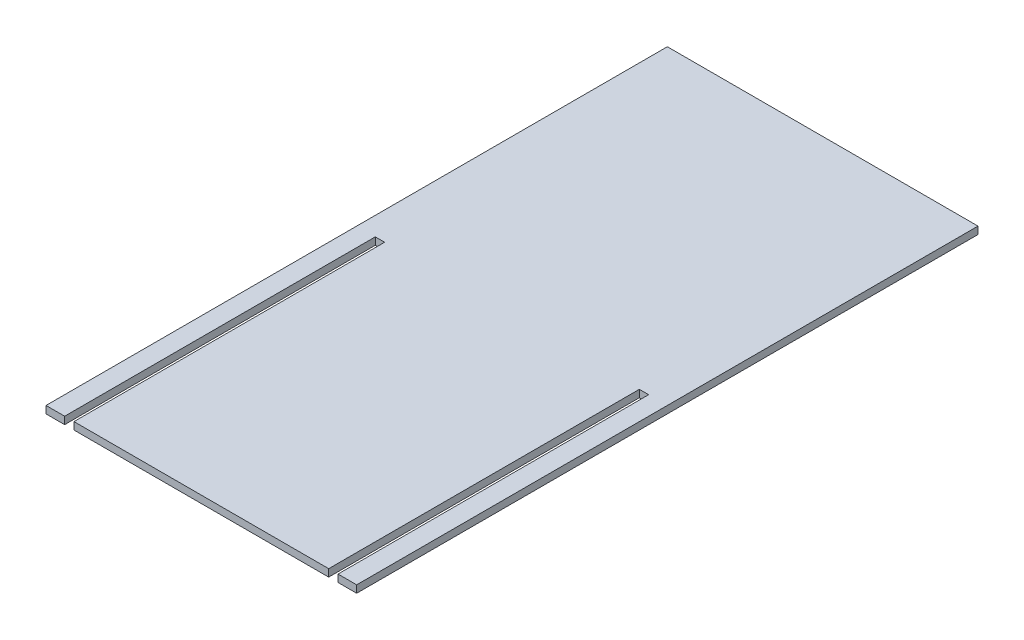
ISO-10303-21;
HEADER;
FILE_DESCRIPTION(('STEP AP214'),'2;1');
FILE_NAME('part.step','',(''),(''),'','','');
FILE_SCHEMA(('AUTOMOTIVE_DESIGN { 1 0 10303 214 1 1 1 1 }'));
ENDSEC;
DATA;
#1=APPLICATION_CONTEXT('core data for automotive mechanical design processes');
#2=APPLICATION_PROTOCOL_DEFINITION('international standard','automotive_design',2000,#1);
#3=PRODUCT_CONTEXT('',#1,'mechanical');
#4=PRODUCT('Part','Part','',(#3));
#5=PRODUCT_RELATED_PRODUCT_CATEGORY('part','',(#4));
#6=PRODUCT_DEFINITION_FORMATION('','',#4);
#7=PRODUCT_DEFINITION_CONTEXT('part definition',#1,'design');
#8=PRODUCT_DEFINITION('design','',#6,#7);
#9=PRODUCT_DEFINITION_SHAPE('','',#8);
#10=(LENGTH_UNIT() NAMED_UNIT(*) SI_UNIT(.MILLI.,.METRE.));
#11=(NAMED_UNIT(*) PLANE_ANGLE_UNIT() SI_UNIT($,.RADIAN.));
#12=(NAMED_UNIT(*) SI_UNIT($,.STERADIAN.) SOLID_ANGLE_UNIT());
#13=UNCERTAINTY_MEASURE_WITH_UNIT(LENGTH_MEASURE(1.E-05),#10,'distance_accuracy_value','');
#14=(GEOMETRIC_REPRESENTATION_CONTEXT(3) GLOBAL_UNCERTAINTY_ASSIGNED_CONTEXT((#13)) GLOBAL_UNIT_ASSIGNED_CONTEXT((#10,
#11,#12)) REPRESENTATION_CONTEXT('',''));
#15=CARTESIAN_POINT('',(0.,0.,0.));
#16=DIRECTION('',(0.,0.,1.));
#17=DIRECTION('',(1.,0.,0.));
#18=AXIS2_PLACEMENT_3D('',#15,#16,#17);
#19=CARTESIAN_POINT('',(0.,3.,0.));
#20=DIRECTION('',(0.,0.,-1.));
#21=DIRECTION('',(-1.,0.,0.));
#22=AXIS2_PLACEMENT_3D('',#19,#20,#21);
#23=PLANE('',#22);
#24=DIRECTION('',(1.,0.,0.));
#25=VECTOR('',#24,1.);
#26=CARTESIAN_POINT('',(0.,3.,0.));
#27=LINE('',#26,#25);
#28=CARTESIAN_POINT('',(119.38,3.,0.));
#29=VERTEX_POINT('',#28);
#30=CARTESIAN_POINT('',(127.,3.,0.));
#31=VERTEX_POINT('',#30);
#32=EDGE_CURVE('E185',#29,#31,#27,.T.);
#33=ORIENTED_EDGE('',*,*,#32,.F.);
#34=DIRECTION('',(0.,1.,0.));
#35=VECTOR('',#34,1.);
#36=CARTESIAN_POINT('',(119.38,0.,0.));
#37=LINE('',#36,#35);
#38=CARTESIAN_POINT('',(119.38,0.,0.));
#39=VERTEX_POINT('',#38);
#40=EDGE_CURVE('E151',#39,#29,#37,.T.);
#41=ORIENTED_EDGE('',*,*,#40,.F.);
#42=DIRECTION('',(1.,0.,0.));
#43=VECTOR('',#42,1.);
#44=CARTESIAN_POINT('',(0.,0.,0.));
#45=LINE('',#44,#43);
#46=CARTESIAN_POINT('',(127.,0.,0.));
#47=VERTEX_POINT('',#46);
#48=EDGE_CURVE('E142',#39,#47,#45,.T.);
#49=ORIENTED_EDGE('',*,*,#48,.T.);
#50=DIRECTION('',(0.,-1.,0.));
#51=VECTOR('',#50,1.);
#52=CARTESIAN_POINT('',(127.,3.,0.));
#53=LINE('',#52,#51);
#54=EDGE_CURVE('E41',#31,#47,#53,.T.);
#55=ORIENTED_EDGE('',*,*,#54,.F.);
#56=EDGE_LOOP('',(#33,#41,#49,#55));
#57=FACE_BOUND('',#56,.T.);
#58=ADVANCED_FACE('F33',(#57),#23,.F.);
#59=CARTESIAN_POINT('',(0.,0.,0.));
#60=VERTEX_POINT('',#59);
#61=CARTESIAN_POINT('',(7.62,0.,0.));
#62=VERTEX_POINT('',#61);
#63=EDGE_CURVE('E198',#60,#62,#45,.T.);
#64=ORIENTED_EDGE('',*,*,#63,.T.);
#65=DIRECTION('',(0.,1.,0.));
#66=VECTOR('',#65,1.);
#67=CARTESIAN_POINT('',(7.62,0.,0.));
#68=LINE('',#67,#66);
#69=CARTESIAN_POINT('',(7.62,3.,0.));
#70=VERTEX_POINT('',#69);
#71=EDGE_CURVE('E166',#62,#70,#68,.T.);
#72=ORIENTED_EDGE('',*,*,#71,.T.);
#73=CARTESIAN_POINT('',(0.,3.,0.));
#74=VERTEX_POINT('',#73);
#75=EDGE_CURVE('E187',#74,#70,#27,.T.);
#76=ORIENTED_EDGE('',*,*,#75,.F.);
#77=DIRECTION('',(0.,-1.,0.));
#78=VECTOR('',#77,1.);
#79=CARTESIAN_POINT('',(0.,3.,0.));
#80=LINE('',#79,#78);
#81=EDGE_CURVE('E11',#74,#60,#80,.T.);
#82=ORIENTED_EDGE('',*,*,#81,.T.);
#83=EDGE_LOOP('',(#64,#72,#76,#82));
#84=FACE_BOUND('',#83,.T.);
#85=ADVANCED_FACE('F241',(#84),#23,.F.);
#86=CARTESIAN_POINT('',(0.,3.,-254.));
#87=DIRECTION('',(1.,0.,0.));
#88=DIRECTION('',(0.,0.,-1.));
#89=AXIS2_PLACEMENT_3D('',#86,#87,#88);
#90=PLANE('',#89);
#91=DIRECTION('',(0.,0.,1.));
#92=VECTOR('',#91,1.);
#93=CARTESIAN_POINT('',(0.,0.,-254.));
#94=LINE('',#93,#92);
#95=CARTESIAN_POINT('',(0.,0.,-254.));
#96=VERTEX_POINT('',#95);
#97=EDGE_CURVE('E175',#96,#60,#94,.T.);
#98=ORIENTED_EDGE('',*,*,#97,.T.);
#99=ORIENTED_EDGE('',*,*,#81,.F.);
#100=DIRECTION('',(0.,0.,1.));
#101=VECTOR('',#100,1.);
#102=CARTESIAN_POINT('',(0.,3.,-254.));
#103=LINE('',#102,#101);
#104=CARTESIAN_POINT('',(0.,3.,-254.));
#105=VERTEX_POINT('',#104);
#106=EDGE_CURVE('E182',#105,#74,#103,.T.);
#107=ORIENTED_EDGE('',*,*,#106,.F.);
#108=DIRECTION('',(0.,-1.,0.));
#109=VECTOR('',#108,1.);
#110=CARTESIAN_POINT('',(0.,3.,-254.));
#111=LINE('',#110,#109);
#112=EDGE_CURVE('E195',#105,#96,#111,.T.);
#113=ORIENTED_EDGE('',*,*,#112,.T.);
#114=EDGE_LOOP('',(#98,#99,#107,#113));
#115=FACE_BOUND('',#114,.T.);
#116=ADVANCED_FACE('F35',(#115),#90,.F.);
#117=CARTESIAN_POINT('',(11.43,0.,0.));
#118=VERTEX_POINT('',#117);
#119=CARTESIAN_POINT('',(115.57,0.,0.));
#120=VERTEX_POINT('',#119);
#121=EDGE_CURVE('E202',#118,#120,#45,.T.);
#122=ORIENTED_EDGE('',*,*,#121,.T.);
#123=DIRECTION('',(0.,1.,0.));
#124=VECTOR('',#123,1.);
#125=CARTESIAN_POINT('',(115.57,0.,0.));
#126=LINE('',#125,#124);
#127=CARTESIAN_POINT('',(115.57,3.,0.));
#128=VERTEX_POINT('',#127);
#129=EDGE_CURVE('E154',#120,#128,#126,.T.);
#130=ORIENTED_EDGE('',*,*,#129,.T.);
#131=CARTESIAN_POINT('',(11.43,3.,0.));
#132=VERTEX_POINT('',#131);
#133=EDGE_CURVE('E191',#132,#128,#27,.T.);
#134=ORIENTED_EDGE('',*,*,#133,.F.);
#135=DIRECTION('',(0.,1.,0.));
#136=VECTOR('',#135,1.);
#137=CARTESIAN_POINT('',(11.43,0.,0.));
#138=LINE('',#137,#136);
#139=EDGE_CURVE('E178',#118,#132,#138,.T.);
#140=ORIENTED_EDGE('',*,*,#139,.F.);
#141=EDGE_LOOP('',(#122,#130,#134,#140));
#142=FACE_BOUND('',#141,.T.);
#143=ADVANCED_FACE('F237',(#142),#23,.F.);
#144=CARTESIAN_POINT('',(127.,3.,-254.));
#145=DIRECTION('',(-1.,0.,0.));
#146=DIRECTION('',(0.,0.,1.));
#147=AXIS2_PLACEMENT_3D('',#144,#145,#146);
#148=PLANE('',#147);
#149=DIRECTION('',(0.,0.,-1.));
#150=VECTOR('',#149,1.);
#151=CARTESIAN_POINT('',(127.,0.,-254.));
#152=LINE('',#151,#150);
#153=CARTESIAN_POINT('',(127.,0.,-254.));
#154=VERTEX_POINT('',#153);
#155=EDGE_CURVE('E201',#47,#154,#152,.T.);
#156=ORIENTED_EDGE('',*,*,#155,.T.);
#157=DIRECTION('',(0.,-1.,0.));
#158=VECTOR('',#157,1.);
#159=CARTESIAN_POINT('',(127.,3.,-254.));
#160=LINE('',#159,#158);
#161=CARTESIAN_POINT('',(127.,3.,-254.));
#162=VERTEX_POINT('',#161);
#163=EDGE_CURVE('E207',#162,#154,#160,.T.);
#164=ORIENTED_EDGE('',*,*,#163,.F.);
#165=DIRECTION('',(0.,0.,-1.));
#166=VECTOR('',#165,1.);
#167=CARTESIAN_POINT('',(127.,3.,-254.));
#168=LINE('',#167,#166);
#169=EDGE_CURVE('E190',#31,#162,#168,.T.);
#170=ORIENTED_EDGE('',*,*,#169,.F.);
#171=ORIENTED_EDGE('',*,*,#54,.T.);
#172=EDGE_LOOP('',(#156,#164,#170,#171));
#173=FACE_BOUND('',#172,.T.);
#174=ADVANCED_FACE('F213',(#173),#148,.F.);
#175=CARTESIAN_POINT('',(0.,3.,-254.));
#176=DIRECTION('',(0.,0.,1.));
#177=DIRECTION('',(1.,0.,0.));
#178=AXIS2_PLACEMENT_3D('',#175,#176,#177);
#179=PLANE('',#178);
#180=DIRECTION('',(-1.,0.,0.));
#181=VECTOR('',#180,1.);
#182=CARTESIAN_POINT('',(0.,0.,-254.));
#183=LINE('',#182,#181);
#184=EDGE_CURVE('E186',#154,#96,#183,.T.);
#185=ORIENTED_EDGE('',*,*,#184,.T.);
#186=ORIENTED_EDGE('',*,*,#112,.F.);
#187=DIRECTION('',(-1.,0.,0.));
#188=VECTOR('',#187,1.);
#189=CARTESIAN_POINT('',(0.,3.,-254.));
#190=LINE('',#189,#188);
#191=EDGE_CURVE('E193',#162,#105,#190,.T.);
#192=ORIENTED_EDGE('',*,*,#191,.F.);
#193=ORIENTED_EDGE('',*,*,#163,.T.);
#194=EDGE_LOOP('',(#185,#186,#192,#193));
#195=FACE_BOUND('',#194,.T.);
#196=ADVANCED_FACE('F221',(#195),#179,.F.);
#197=CARTESIAN_POINT('',(0.,3.,0.));
#198=DIRECTION('',(0.,1.,0.));
#199=DIRECTION('',(0.,0.,1.));
#200=AXIS2_PLACEMENT_3D('',#197,#198,#199);
#201=PLANE('',#200);
#202=DIRECTION('',(0.,0.,-1.));
#203=VECTOR('',#202,1.);
#204=CARTESIAN_POINT('',(119.38,3.,-127.));
#205=LINE('',#204,#203);
#206=CARTESIAN_POINT('',(119.38,3.,-127.));
#207=VERTEX_POINT('',#206);
#208=EDGE_CURVE('E128',#29,#207,#205,.T.);
#209=ORIENTED_EDGE('',*,*,#208,.F.);
#210=ORIENTED_EDGE('',*,*,#32,.T.);
#211=ORIENTED_EDGE('',*,*,#169,.T.);
#212=ORIENTED_EDGE('',*,*,#191,.T.);
#213=ORIENTED_EDGE('',*,*,#106,.T.);
#214=ORIENTED_EDGE('',*,*,#75,.T.);
#215=DIRECTION('',(0.,0.,1.));
#216=VECTOR('',#215,1.);
#217=CARTESIAN_POINT('',(7.61999999999999,3.,-127.));
#218=LINE('',#217,#216);
#219=CARTESIAN_POINT('',(7.61999999999999,3.,-127.));
#220=VERTEX_POINT('',#219);
#221=EDGE_CURVE('E153',#220,#70,#218,.T.);
#222=ORIENTED_EDGE('',*,*,#221,.F.);
#223=DIRECTION('',(-1.,0.,0.));
#224=VECTOR('',#223,1.);
#225=CARTESIAN_POINT('',(7.61999999999999,3.,-127.));
#226=LINE('',#225,#224);
#227=CARTESIAN_POINT('',(11.43,3.,-127.));
#228=VERTEX_POINT('',#227);
#229=EDGE_CURVE('E162',#228,#220,#226,.T.);
#230=ORIENTED_EDGE('',*,*,#229,.F.);
#231=DIRECTION('',(0.,0.,-1.));
#232=VECTOR('',#231,1.);
#233=CARTESIAN_POINT('',(11.43,3.,-127.));
#234=LINE('',#233,#232);
#235=EDGE_CURVE('E168',#132,#228,#234,.T.);
#236=ORIENTED_EDGE('',*,*,#235,.F.);
#237=ORIENTED_EDGE('',*,*,#133,.T.);
#238=DIRECTION('',(0.,0.,1.));
#239=VECTOR('',#238,1.);
#240=CARTESIAN_POINT('',(115.57,3.,-127.));
#241=LINE('',#240,#239);
#242=CARTESIAN_POINT('',(115.57,3.,-127.));
#243=VERTEX_POINT('',#242);
#244=EDGE_CURVE('E143',#243,#128,#241,.T.);
#245=ORIENTED_EDGE('',*,*,#244,.F.);
#246=DIRECTION('',(-1.,0.,0.));
#247=VECTOR('',#246,1.);
#248=CARTESIAN_POINT('',(119.38,3.,-127.));
#249=LINE('',#248,#247);
#250=EDGE_CURVE('E145',#207,#243,#249,.T.);
#251=ORIENTED_EDGE('',*,*,#250,.F.);
#252=EDGE_LOOP('',(#209,#210,#211,#212,#213,#214,#222,#230,#236,#237,#245,#251));
#253=FACE_BOUND('',#252,.T.);
#254=ADVANCED_FACE('F227',(#253),#201,.T.);
#255=CARTESIAN_POINT('',(0.,0.,0.));
#256=DIRECTION('',(0.,1.,0.));
#257=DIRECTION('',(0.,0.,1.));
#258=AXIS2_PLACEMENT_3D('',#255,#256,#257);
#259=PLANE('',#258);
#260=ORIENTED_EDGE('',*,*,#48,.F.);
#261=DIRECTION('',(0.,0.,-1.));
#262=VECTOR('',#261,1.);
#263=CARTESIAN_POINT('',(119.38,0.,-127.));
#264=LINE('',#263,#262);
#265=CARTESIAN_POINT('',(119.38,0.,-127.));
#266=VERTEX_POINT('',#265);
#267=EDGE_CURVE('E125',#39,#266,#264,.T.);
#268=ORIENTED_EDGE('',*,*,#267,.T.);
#269=DIRECTION('',(-1.,0.,0.));
#270=VECTOR('',#269,1.);
#271=CARTESIAN_POINT('',(119.38,0.,-127.));
#272=LINE('',#271,#270);
#273=CARTESIAN_POINT('',(115.57,0.,-127.));
#274=VERTEX_POINT('',#273);
#275=EDGE_CURVE('E135',#266,#274,#272,.T.);
#276=ORIENTED_EDGE('',*,*,#275,.T.);
#277=DIRECTION('',(0.,0.,1.));
#278=VECTOR('',#277,1.);
#279=CARTESIAN_POINT('',(115.57,0.,-127.));
#280=LINE('',#279,#278);
#281=EDGE_CURVE('E48',#274,#120,#280,.T.);
#282=ORIENTED_EDGE('',*,*,#281,.T.);
#283=ORIENTED_EDGE('',*,*,#121,.F.);
#284=DIRECTION('',(0.,0.,-1.));
#285=VECTOR('',#284,1.);
#286=CARTESIAN_POINT('',(11.43,0.,-127.));
#287=LINE('',#286,#285);
#288=CARTESIAN_POINT('',(11.43,0.,-127.));
#289=VERTEX_POINT('',#288);
#290=EDGE_CURVE('E161',#118,#289,#287,.T.);
#291=ORIENTED_EDGE('',*,*,#290,.T.);
#292=DIRECTION('',(-1.,0.,0.));
#293=VECTOR('',#292,1.);
#294=CARTESIAN_POINT('',(7.61999999999999,0.,-127.));
#295=LINE('',#294,#293);
#296=CARTESIAN_POINT('',(7.61999999999999,0.,-127.));
#297=VERTEX_POINT('',#296);
#298=EDGE_CURVE('E56',#289,#297,#295,.T.);
#299=ORIENTED_EDGE('',*,*,#298,.T.);
#300=DIRECTION('',(0.,0.,1.));
#301=VECTOR('',#300,1.);
#302=CARTESIAN_POINT('',(7.61999999999999,0.,-127.));
#303=LINE('',#302,#301);
#304=EDGE_CURVE('E158',#297,#62,#303,.T.);
#305=ORIENTED_EDGE('',*,*,#304,.T.);
#306=ORIENTED_EDGE('',*,*,#63,.F.);
#307=ORIENTED_EDGE('',*,*,#97,.F.);
#308=ORIENTED_EDGE('',*,*,#184,.F.);
#309=ORIENTED_EDGE('',*,*,#155,.F.);
#310=EDGE_LOOP('',(#260,#268,#276,#282,#283,#291,#299,#305,#306,#307,#308,#309));
#311=FACE_BOUND('',#310,.T.);
#312=ADVANCED_FACE('F140',(#311),#259,.F.);
#313=CARTESIAN_POINT('',(7.61999999999999,0.,-127.));
#314=DIRECTION('',(-1.,0.,0.));
#315=DIRECTION('',(0.,0.,1.));
#316=AXIS2_PLACEMENT_3D('',#313,#314,#315);
#317=PLANE('',#316);
#318=ORIENTED_EDGE('',*,*,#221,.T.);
#319=ORIENTED_EDGE('',*,*,#71,.F.);
#320=ORIENTED_EDGE('',*,*,#304,.F.);
#321=DIRECTION('',(0.,1.,0.));
#322=VECTOR('',#321,1.);
#323=CARTESIAN_POINT('',(7.61999999999999,0.,-127.));
#324=LINE('',#323,#322);
#325=EDGE_CURVE('E173',#297,#220,#324,.T.);
#326=ORIENTED_EDGE('',*,*,#325,.T.);
#327=EDGE_LOOP('',(#318,#319,#320,#326));
#328=FACE_BOUND('',#327,.T.);
#329=ADVANCED_FACE('F286',(#328),#317,.F.);
#330=CARTESIAN_POINT('',(7.61999999999999,0.,-127.));
#331=DIRECTION('',(0.,0.,-1.));
#332=DIRECTION('',(-1.,0.,0.));
#333=AXIS2_PLACEMENT_3D('',#330,#331,#332);
#334=PLANE('',#333);
#335=ORIENTED_EDGE('',*,*,#229,.T.);
#336=ORIENTED_EDGE('',*,*,#325,.F.);
#337=ORIENTED_EDGE('',*,*,#298,.F.);
#338=DIRECTION('',(0.,1.,0.));
#339=VECTOR('',#338,1.);
#340=CARTESIAN_POINT('',(11.43,0.,-127.));
#341=LINE('',#340,#339);
#342=EDGE_CURVE('E176',#289,#228,#341,.T.);
#343=ORIENTED_EDGE('',*,*,#342,.T.);
#344=EDGE_LOOP('',(#335,#336,#337,#343));
#345=FACE_BOUND('',#344,.T.);
#346=ADVANCED_FACE('F295',(#345),#334,.F.);
#347=CARTESIAN_POINT('',(11.43,0.,-127.));
#348=DIRECTION('',(1.,0.,0.));
#349=DIRECTION('',(0.,0.,-1.));
#350=AXIS2_PLACEMENT_3D('',#347,#348,#349);
#351=PLANE('',#350);
#352=ORIENTED_EDGE('',*,*,#235,.T.);
#353=ORIENTED_EDGE('',*,*,#342,.F.);
#354=ORIENTED_EDGE('',*,*,#290,.F.);
#355=ORIENTED_EDGE('',*,*,#139,.T.);
#356=EDGE_LOOP('',(#352,#353,#354,#355));
#357=FACE_BOUND('',#356,.T.);
#358=ADVANCED_FACE('F305',(#357),#351,.F.);
#359=CARTESIAN_POINT('',(119.38,0.,-127.));
#360=DIRECTION('',(1.,0.,0.));
#361=DIRECTION('',(0.,0.,-1.));
#362=AXIS2_PLACEMENT_3D('',#359,#360,#361);
#363=PLANE('',#362);
#364=ORIENTED_EDGE('',*,*,#208,.T.);
#365=DIRECTION('',(0.,1.,0.));
#366=VECTOR('',#365,1.);
#367=CARTESIAN_POINT('',(119.38,0.,-127.));
#368=LINE('',#367,#366);
#369=EDGE_CURVE('E121',#266,#207,#368,.T.);
#370=ORIENTED_EDGE('',*,*,#369,.F.);
#371=ORIENTED_EDGE('',*,*,#267,.F.);
#372=ORIENTED_EDGE('',*,*,#40,.T.);
#373=EDGE_LOOP('',(#364,#370,#371,#372));
#374=FACE_BOUND('',#373,.T.);
#375=ADVANCED_FACE('F123',(#374),#363,.F.);
#376=CARTESIAN_POINT('',(115.57,0.,-127.));
#377=DIRECTION('',(-1.,0.,0.));
#378=DIRECTION('',(0.,0.,1.));
#379=AXIS2_PLACEMENT_3D('',#376,#377,#378);
#380=PLANE('',#379);
#381=ORIENTED_EDGE('',*,*,#244,.T.);
#382=ORIENTED_EDGE('',*,*,#129,.F.);
#383=ORIENTED_EDGE('',*,*,#281,.F.);
#384=DIRECTION('',(0.,1.,0.));
#385=VECTOR('',#384,1.);
#386=CARTESIAN_POINT('',(115.57,0.,-127.));
#387=LINE('',#386,#385);
#388=EDGE_CURVE('E132',#274,#243,#387,.T.);
#389=ORIENTED_EDGE('',*,*,#388,.T.);
#390=EDGE_LOOP('',(#381,#382,#383,#389));
#391=FACE_BOUND('',#390,.T.);
#392=ADVANCED_FACE('F239',(#391),#380,.F.);
#393=CARTESIAN_POINT('',(119.38,0.,-127.));
#394=DIRECTION('',(0.,0.,-1.));
#395=DIRECTION('',(-1.,0.,0.));
#396=AXIS2_PLACEMENT_3D('',#393,#394,#395);
#397=PLANE('',#396);
#398=ORIENTED_EDGE('',*,*,#250,.T.);
#399=ORIENTED_EDGE('',*,*,#388,.F.);
#400=ORIENTED_EDGE('',*,*,#275,.F.);
#401=ORIENTED_EDGE('',*,*,#369,.T.);
#402=EDGE_LOOP('',(#398,#399,#400,#401));
#403=FACE_BOUND('',#402,.T.);
#404=ADVANCED_FACE('F136',(#403),#397,.F.);
#405=CLOSED_SHELL('',(#58,#85,#116,#143,#174,#196,#254,#312,#329,#346,#358,#375,#392,#404));
#406=MANIFOLD_SOLID_BREP('B2',#405);
#407=ADVANCED_BREP_SHAPE_REPRESENTATION('',(#18,#406),#14);
#408=SHAPE_DEFINITION_REPRESENTATION(#9,#407);
ENDSEC;
END-ISO-10303-21;
